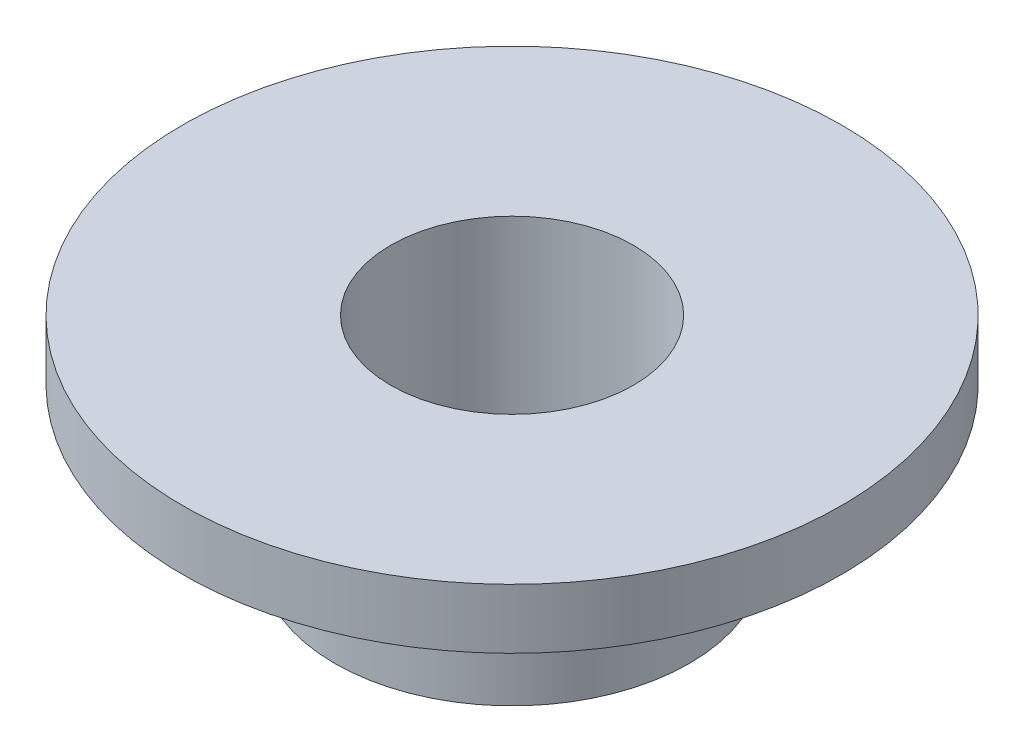
ISO-10303-21;
HEADER;
FILE_DESCRIPTION(('STEP AP214'),'2;1');
FILE_NAME('part.step','',(''),(''),'','','');
FILE_SCHEMA(('AUTOMOTIVE_DESIGN { 1 0 10303 214 1 1 1 1 }'));
ENDSEC;
DATA;
#1=APPLICATION_CONTEXT('core data for automotive mechanical design processes');
#2=APPLICATION_PROTOCOL_DEFINITION('international standard','automotive_design',2000,#1);
#3=PRODUCT_CONTEXT('',#1,'mechanical');
#4=PRODUCT('Part','Part','',(#3));
#5=PRODUCT_RELATED_PRODUCT_CATEGORY('part','',(#4));
#6=PRODUCT_DEFINITION_FORMATION('','',#4);
#7=PRODUCT_DEFINITION_CONTEXT('part definition',#1,'design');
#8=PRODUCT_DEFINITION('design','',#6,#7);
#9=PRODUCT_DEFINITION_SHAPE('','',#8);
#10=(LENGTH_UNIT() NAMED_UNIT(*) SI_UNIT(.MILLI.,.METRE.));
#11=(NAMED_UNIT(*) PLANE_ANGLE_UNIT() SI_UNIT($,.RADIAN.));
#12=(NAMED_UNIT(*) SI_UNIT($,.STERADIAN.) SOLID_ANGLE_UNIT());
#13=UNCERTAINTY_MEASURE_WITH_UNIT(LENGTH_MEASURE(1.E-05),#10,'distance_accuracy_value','');
#14=(GEOMETRIC_REPRESENTATION_CONTEXT(3) GLOBAL_UNCERTAINTY_ASSIGNED_CONTEXT((#13)) GLOBAL_UNIT_ASSIGNED_CONTEXT((#10,
#11,#12)) REPRESENTATION_CONTEXT('',''));
#15=CARTESIAN_POINT('',(0.,0.,0.));
#16=DIRECTION('',(0.,0.,1.));
#17=DIRECTION('',(1.,0.,0.));
#18=AXIS2_PLACEMENT_3D('',#15,#16,#17);
#19=CARTESIAN_POINT('',(39.8577939001171,-27.6371426298124,10.4000283791901));
#20=DIRECTION('',(0.,-1.,0.));
#21=DIRECTION('',(0.,0.,-1.));
#22=AXIS2_PLACEMENT_3D('',#19,#20,#21);
#23=PLANE('',#22);
#24=CARTESIAN_POINT('',(36.6077939001171,-27.6371426298124,10.4000283791901));
#25=DIRECTION('',(0.,-1.,0.));
#26=DIRECTION('',(0.,0.,-1.));
#27=AXIS2_PLACEMENT_3D('',#24,#25,#26);
#28=CIRCLE('',#27,4.75);
#29=CARTESIAN_POINT('',(36.6077939001171,-27.6371426298124,5.65002837919012));
#30=VERTEX_POINT('',#29);
#31=EDGE_CURVE('E10',#30,#30,#28,.T.);
#32=ORIENTED_EDGE('',*,*,#31,.T.);
#33=EDGE_LOOP('',(#32));
#34=FACE_BOUND('',#33,.T.);
#35=CARTESIAN_POINT('',(36.6077939001171,-27.6371426298124,10.4000283791901));
#36=DIRECTION('',(0.,-1.,0.));
#37=DIRECTION('',(0.,0.,-1.));
#38=AXIS2_PLACEMENT_3D('',#35,#36,#37);
#39=CIRCLE('',#38,3.24999999999998);
#40=CARTESIAN_POINT('',(36.6077939001171,-27.6371426298124,7.15002837919013));
#41=VERTEX_POINT('',#40);
#42=EDGE_CURVE('E50',#41,#41,#39,.T.);
#43=ORIENTED_EDGE('',*,*,#42,.F.);
#44=EDGE_LOOP('',(#43));
#45=FACE_BOUND('',#44,.T.);
#46=ADVANCED_FACE('F28',(#34,#45),#23,.T.);
#47=CARTESIAN_POINT('',(36.6077939001171,-21.9371426298124,10.4000283791901));
#48=DIRECTION('',(0.,-1.,0.));
#49=DIRECTION('',(0.,0.,-1.));
#50=AXIS2_PLACEMENT_3D('',#47,#48,#49);
#51=CYLINDRICAL_SURFACE('',#50,4.75);
#52=CARTESIAN_POINT('',(36.6077939001171,-23.5371426298124,10.4000283791901));
#53=DIRECTION('',(0.,-1.,0.));
#54=DIRECTION('',(0.,0.,-1.));
#55=AXIS2_PLACEMENT_3D('',#52,#53,#54);
#56=CIRCLE('',#55,4.75);
#57=CARTESIAN_POINT('',(36.6077939001171,-23.5371426298124,5.65002837919012));
#58=VERTEX_POINT('',#57);
#59=EDGE_CURVE('E34',#58,#58,#56,.T.);
#60=ORIENTED_EDGE('',*,*,#59,.T.);
#61=EDGE_LOOP('',(#60));
#62=FACE_BOUND('',#61,.T.);
#63=ORIENTED_EDGE('',*,*,#31,.F.);
#64=EDGE_LOOP('',(#63));
#65=FACE_BOUND('',#64,.T.);
#66=ADVANCED_FACE('F58',(#62,#65),#51,.T.);
#67=CARTESIAN_POINT('',(41.3577939001171,-23.5371426298124,10.4000283791901));
#68=DIRECTION('',(0.,-1.,0.));
#69=DIRECTION('',(0.,0.,-1.));
#70=AXIS2_PLACEMENT_3D('',#67,#68,#69);
#71=PLANE('',#70);
#72=CARTESIAN_POINT('',(36.6077939001171,-23.5371426298124,10.4000283791901));
#73=DIRECTION('',(0.,-1.,0.));
#74=DIRECTION('',(0.,0.,-1.));
#75=AXIS2_PLACEMENT_3D('',#72,#73,#74);
#76=CIRCLE('',#75,8.825);
#77=CARTESIAN_POINT('',(36.6077939001171,-23.5371426298124,1.57502837919011));
#78=VERTEX_POINT('',#77);
#79=EDGE_CURVE('E38',#78,#78,#76,.T.);
#80=ORIENTED_EDGE('',*,*,#79,.T.);
#81=EDGE_LOOP('',(#80));
#82=FACE_BOUND('',#81,.T.);
#83=ORIENTED_EDGE('',*,*,#59,.F.);
#84=EDGE_LOOP('',(#83));
#85=FACE_BOUND('',#84,.T.);
#86=ADVANCED_FACE('F62',(#82,#85),#71,.T.);
#87=CARTESIAN_POINT('',(36.6077939001171,-21.9371426298124,10.4000283791901));
#88=DIRECTION('',(0.,-1.,0.));
#89=DIRECTION('',(0.,0.,-1.));
#90=AXIS2_PLACEMENT_3D('',#87,#88,#89);
#91=CYLINDRICAL_SURFACE('',#90,8.825);
#92=CARTESIAN_POINT('',(36.6077939001171,-21.9371426298124,10.4000283791901));
#93=DIRECTION('',(0.,-1.,0.));
#94=DIRECTION('',(0.,0.,-1.));
#95=AXIS2_PLACEMENT_3D('',#92,#93,#94);
#96=CIRCLE('',#95,8.825);
#97=CARTESIAN_POINT('',(36.6077939001171,-21.9371426298124,1.57502837919011));
#98=VERTEX_POINT('',#97);
#99=EDGE_CURVE('E42',#98,#98,#96,.T.);
#100=ORIENTED_EDGE('',*,*,#99,.T.);
#101=EDGE_LOOP('',(#100));
#102=FACE_BOUND('',#101,.T.);
#103=ORIENTED_EDGE('',*,*,#79,.F.);
#104=EDGE_LOOP('',(#103));
#105=FACE_BOUND('',#104,.T.);
#106=ADVANCED_FACE('F66',(#102,#105),#91,.T.);
#107=CARTESIAN_POINT('',(45.4327939001171,-21.9371426298124,10.4000283791901));
#108=DIRECTION('',(0.,1.,0.));
#109=DIRECTION('',(0.,0.,1.));
#110=AXIS2_PLACEMENT_3D('',#107,#108,#109);
#111=PLANE('',#110);
#112=CARTESIAN_POINT('',(36.6077939001171,-21.9371426298124,10.4000283791901));
#113=DIRECTION('',(0.,-1.,0.));
#114=DIRECTION('',(0.,0.,-1.));
#115=AXIS2_PLACEMENT_3D('',#112,#113,#114);
#116=CIRCLE('',#115,3.24999999999998);
#117=CARTESIAN_POINT('',(36.6077939001171,-21.9371426298124,7.15002837919013));
#118=VERTEX_POINT('',#117);
#119=EDGE_CURVE('E47',#118,#118,#116,.T.);
#120=ORIENTED_EDGE('',*,*,#119,.T.);
#121=EDGE_LOOP('',(#120));
#122=FACE_BOUND('',#121,.T.);
#123=ORIENTED_EDGE('',*,*,#99,.F.);
#124=EDGE_LOOP('',(#123));
#125=FACE_BOUND('',#124,.T.);
#126=ADVANCED_FACE('F73',(#122,#125),#111,.T.);
#127=CARTESIAN_POINT('',(36.6077939001171,-21.9371426298124,10.4000283791901));
#128=DIRECTION('',(0.,-1.,0.));
#129=DIRECTION('',(0.,0.,-1.));
#130=AXIS2_PLACEMENT_3D('',#127,#128,#129);
#131=CYLINDRICAL_SURFACE('',#130,3.24999999999998);
#132=ORIENTED_EDGE('',*,*,#42,.T.);
#133=EDGE_LOOP('',(#132));
#134=FACE_BOUND('',#133,.T.);
#135=ORIENTED_EDGE('',*,*,#119,.F.);
#136=EDGE_LOOP('',(#135));
#137=FACE_BOUND('',#136,.T.);
#138=ADVANCED_FACE('F54',(#134,#137),#131,.F.);
#139=CLOSED_SHELL('',(#46,#66,#86,#106,#126,#138));
#140=MANIFOLD_SOLID_BREP('B2',#139);
#141=ADVANCED_BREP_SHAPE_REPRESENTATION('',(#18,#140),#14);
#142=SHAPE_DEFINITION_REPRESENTATION(#9,#141);
ENDSEC;
END-ISO-10303-21;
